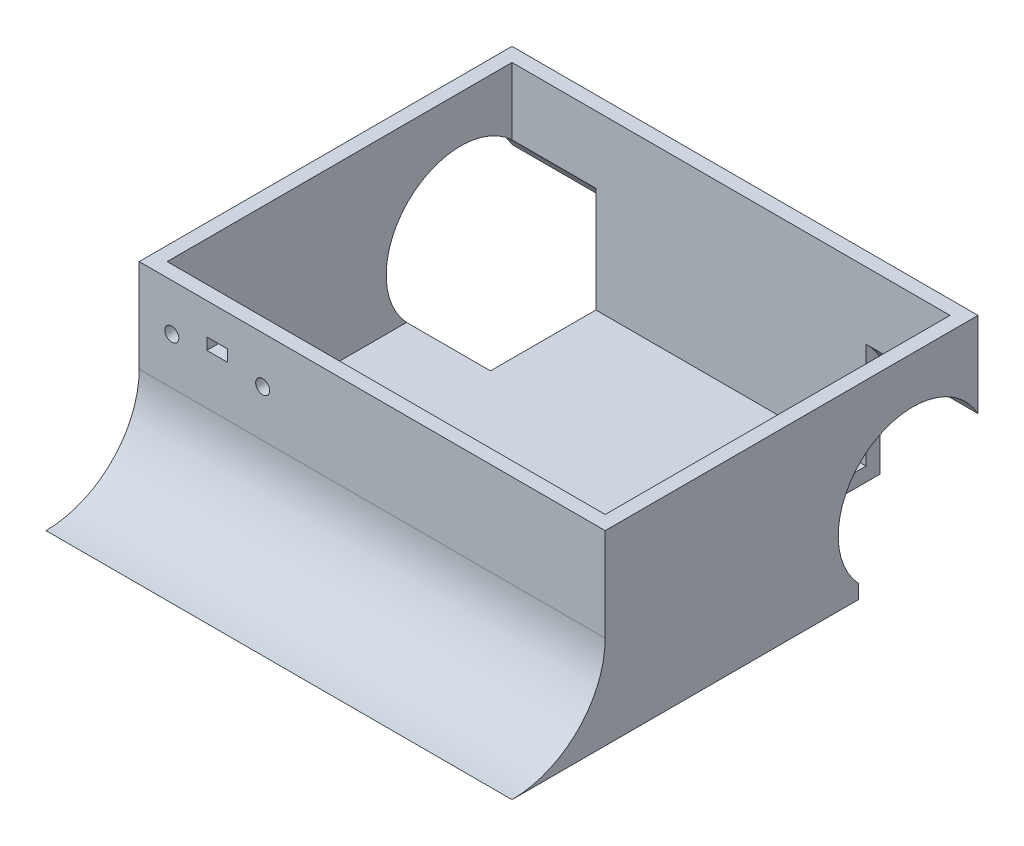
ISO-10303-21;
HEADER;
FILE_DESCRIPTION(('STEP AP214'),'2;1');
FILE_NAME('part.step','',(''),(''),'','','');
FILE_SCHEMA(('AUTOMOTIVE_DESIGN { 1 0 10303 214 1 1 1 1 }'));
ENDSEC;
DATA;
#1=APPLICATION_CONTEXT('core data for automotive mechanical design processes');
#2=APPLICATION_PROTOCOL_DEFINITION('international standard','automotive_design',2000,#1);
#3=PRODUCT_CONTEXT('',#1,'mechanical');
#4=PRODUCT('Part','Part','',(#3));
#5=PRODUCT_RELATED_PRODUCT_CATEGORY('part','',(#4));
#6=PRODUCT_DEFINITION_FORMATION('','',#4);
#7=PRODUCT_DEFINITION_CONTEXT('part definition',#1,'design');
#8=PRODUCT_DEFINITION('design','',#6,#7);
#9=PRODUCT_DEFINITION_SHAPE('','',#8);
#10=(LENGTH_UNIT() NAMED_UNIT(*) SI_UNIT(.MILLI.,.METRE.));
#11=(NAMED_UNIT(*) PLANE_ANGLE_UNIT() SI_UNIT($,.RADIAN.));
#12=(NAMED_UNIT(*) SI_UNIT($,.STERADIAN.) SOLID_ANGLE_UNIT());
#13=UNCERTAINTY_MEASURE_WITH_UNIT(LENGTH_MEASURE(1.E-05),#10,'distance_accuracy_value','');
#14=(GEOMETRIC_REPRESENTATION_CONTEXT(3) GLOBAL_UNCERTAINTY_ASSIGNED_CONTEXT((#13)) GLOBAL_UNIT_ASSIGNED_CONTEXT((#10,
#11,#12)) REPRESENTATION_CONTEXT('',''));
#15=CARTESIAN_POINT('',(0.,0.,0.));
#16=DIRECTION('',(0.,0.,1.));
#17=DIRECTION('',(1.,0.,0.));
#18=AXIS2_PLACEMENT_3D('',#15,#16,#17);
#19=CARTESIAN_POINT('',(-50.,0.,30.));
#20=DIRECTION('',(0.,0.,1.));
#21=DIRECTION('',(1.,0.,0.));
#22=AXIS2_PLACEMENT_3D('',#19,#20,#21);
#23=PLANE('',#22);
#24=CARTESIAN_POINT('',(-43.,10.,30.));
#25=DIRECTION('',(0.,0.,1.));
#26=DIRECTION('',(1.,0.,0.));
#27=AXIS2_PLACEMENT_3D('',#24,#25,#26);
#28=CIRCLE('',#27,1.5);
#29=CARTESIAN_POINT('',(-41.5,10.,30.));
#30=VERTEX_POINT('',#29);
#31=EDGE_CURVE('E209',#30,#30,#28,.F.);
#32=ORIENTED_EDGE('',*,*,#31,.T.);
#33=EDGE_LOOP('',(#32));
#34=FACE_BOUND('',#33,.T.);
#35=DIRECTION('',(1.,0.,0.));
#36=VECTOR('',#35,1.);
#37=CARTESIAN_POINT('',(-50.,20.,30.));
#38=LINE('',#37,#36);
#39=CARTESIAN_POINT('',(-50.,20.,30.));
#40=VERTEX_POINT('',#39);
#41=CARTESIAN_POINT('',(50.,20.,30.));
#42=VERTEX_POINT('',#41);
#43=EDGE_CURVE('E320',#40,#42,#38,.T.);
#44=ORIENTED_EDGE('',*,*,#43,.F.);
#45=DIRECTION('',(0.,-1.,0.));
#46=VECTOR('',#45,1.);
#47=CARTESIAN_POINT('',(-50.,0.,30.));
#48=LINE('',#47,#46);
#49=CARTESIAN_POINT('',(-50.,0.,30.));
#50=VERTEX_POINT('',#49);
#51=EDGE_CURVE('E317',#40,#50,#48,.T.);
#52=ORIENTED_EDGE('',*,*,#51,.T.);
#53=DIRECTION('',(1.,0.,0.));
#54=VECTOR('',#53,1.);
#55=CARTESIAN_POINT('',(-50.,0.,30.));
#56=LINE('',#55,#54);
#57=CARTESIAN_POINT('',(50.,0.,30.));
#58=VERTEX_POINT('',#57);
#59=EDGE_CURVE('E319',#50,#58,#56,.T.);
#60=ORIENTED_EDGE('',*,*,#59,.T.);
#61=DIRECTION('',(0.,-1.,0.));
#62=VECTOR('',#61,1.);
#63=CARTESIAN_POINT('',(50.,0.,30.));
#64=LINE('',#63,#62);
#65=EDGE_CURVE('E311',#42,#58,#64,.T.);
#66=ORIENTED_EDGE('',*,*,#65,.F.);
#67=EDGE_LOOP('',(#44,#52,#60,#66));
#68=FACE_BOUND('',#67,.T.);
#69=DIRECTION('',(1.,0.,0.));
#70=VECTOR('',#69,1.);
#71=CARTESIAN_POINT('',(-50.,13.25,30.));
#72=LINE('',#71,#70);
#73=CARTESIAN_POINT('',(-35.5,13.25,30.));
#74=VERTEX_POINT('',#73);
#75=CARTESIAN_POINT('',(-31.,13.25,30.));
#76=VERTEX_POINT('',#75);
#77=EDGE_CURVE('E205',#74,#76,#72,.T.);
#78=ORIENTED_EDGE('',*,*,#77,.T.);
#79=DIRECTION('',(0.,-1.,0.));
#80=VECTOR('',#79,1.);
#81=CARTESIAN_POINT('',(-31.,0.,30.));
#82=LINE('',#81,#80);
#83=CARTESIAN_POINT('',(-31.,10.75,30.));
#84=VERTEX_POINT('',#83);
#85=EDGE_CURVE('E199',#76,#84,#82,.T.);
#86=ORIENTED_EDGE('',*,*,#85,.T.);
#87=DIRECTION('',(-1.,0.,0.));
#88=VECTOR('',#87,1.);
#89=CARTESIAN_POINT('',(-50.,10.75,30.));
#90=LINE('',#89,#88);
#91=CARTESIAN_POINT('',(-35.5,10.75,30.));
#92=VERTEX_POINT('',#91);
#93=EDGE_CURVE('E188',#84,#92,#90,.T.);
#94=ORIENTED_EDGE('',*,*,#93,.T.);
#95=DIRECTION('',(0.,1.,0.));
#96=VECTOR('',#95,1.);
#97=CARTESIAN_POINT('',(-35.5,0.,30.));
#98=LINE('',#97,#96);
#99=EDGE_CURVE('E193',#92,#74,#98,.T.);
#100=ORIENTED_EDGE('',*,*,#99,.T.);
#101=EDGE_LOOP('',(#78,#86,#94,#100));
#102=FACE_BOUND('',#101,.T.);
#103=CARTESIAN_POINT('',(-23.5,10.,30.));
#104=DIRECTION('',(0.,0.,1.));
#105=DIRECTION('',(1.,0.,0.));
#106=AXIS2_PLACEMENT_3D('',#103,#104,#105);
#107=CIRCLE('',#106,1.5);
#108=CARTESIAN_POINT('',(-22.,10.,30.));
#109=VERTEX_POINT('',#108);
#110=EDGE_CURVE('E215',#109,#109,#107,.F.);
#111=ORIENTED_EDGE('',*,*,#110,.T.);
#112=EDGE_LOOP('',(#111));
#113=FACE_BOUND('',#112,.T.);
#114=ADVANCED_FACE('F40',(#34,#68,#102,#113),#23,.T.);
#115=CARTESIAN_POINT('',(-47.,20.,27.));
#116=DIRECTION('',(0.,0.,-1.));
#117=DIRECTION('',(-1.,0.,0.));
#118=AXIS2_PLACEMENT_3D('',#115,#116,#117);
#119=PLANE('',#118);
#120=CARTESIAN_POINT('',(-43.,10.,27.));
#121=DIRECTION('',(0.,0.,-1.));
#122=DIRECTION('',(-1.,0.,0.));
#123=AXIS2_PLACEMENT_3D('',#120,#121,#122);
#124=CIRCLE('',#123,1.5);
#125=CARTESIAN_POINT('',(-44.5,10.,27.));
#126=VERTEX_POINT('',#125);
#127=EDGE_CURVE('E206',#126,#126,#124,.F.);
#128=ORIENTED_EDGE('',*,*,#127,.T.);
#129=EDGE_LOOP('',(#128));
#130=FACE_BOUND('',#129,.T.);
#131=DIRECTION('',(0.,-1.,0.));
#132=VECTOR('',#131,1.);
#133=CARTESIAN_POINT('',(47.,20.,27.));
#134=LINE('',#133,#132);
#135=CARTESIAN_POINT('',(47.,20.,27.));
#136=VERTEX_POINT('',#135);
#137=CARTESIAN_POINT('',(47.,-17.,27.));
#138=VERTEX_POINT('',#137);
#139=EDGE_CURVE('E298',#136,#138,#134,.T.);
#140=ORIENTED_EDGE('',*,*,#139,.T.);
#141=DIRECTION('',(1.,0.,0.));
#142=VECTOR('',#141,1.);
#143=CARTESIAN_POINT('',(-47.,-17.,27.));
#144=LINE('',#143,#142);
#145=CARTESIAN_POINT('',(-47.,-17.,27.));
#146=VERTEX_POINT('',#145);
#147=EDGE_CURVE('E278',#146,#138,#144,.T.);
#148=ORIENTED_EDGE('',*,*,#147,.F.);
#149=DIRECTION('',(0.,-1.,0.));
#150=VECTOR('',#149,1.);
#151=CARTESIAN_POINT('',(-47.,20.,27.));
#152=LINE('',#151,#150);
#153=CARTESIAN_POINT('',(-47.,20.,27.));
#154=VERTEX_POINT('',#153);
#155=EDGE_CURVE('E300',#154,#146,#152,.T.);
#156=ORIENTED_EDGE('',*,*,#155,.F.);
#157=DIRECTION('',(1.,0.,0.));
#158=VECTOR('',#157,1.);
#159=CARTESIAN_POINT('',(-47.,20.,27.));
#160=LINE('',#159,#158);
#161=EDGE_CURVE('E296',#154,#136,#160,.T.);
#162=ORIENTED_EDGE('',*,*,#161,.T.);
#163=EDGE_LOOP('',(#140,#148,#156,#162));
#164=FACE_BOUND('',#163,.T.);
#165=DIRECTION('',(1.,0.,0.));
#166=VECTOR('',#165,1.);
#167=CARTESIAN_POINT('',(-47.,10.75,27.));
#168=LINE('',#167,#166);
#169=CARTESIAN_POINT('',(-35.5,10.75,27.));
#170=VERTEX_POINT('',#169);
#171=CARTESIAN_POINT('',(-31.,10.75,27.));
#172=VERTEX_POINT('',#171);
#173=EDGE_CURVE('E359',#170,#172,#168,.T.);
#174=ORIENTED_EDGE('',*,*,#173,.T.);
#175=DIRECTION('',(0.,1.,0.));
#176=VECTOR('',#175,1.);
#177=CARTESIAN_POINT('',(-31.,20.,27.));
#178=LINE('',#177,#176);
#179=CARTESIAN_POINT('',(-31.,13.25,27.));
#180=VERTEX_POINT('',#179);
#181=EDGE_CURVE('E12',#172,#180,#178,.T.);
#182=ORIENTED_EDGE('',*,*,#181,.T.);
#183=DIRECTION('',(-1.,0.,0.));
#184=VECTOR('',#183,1.);
#185=CARTESIAN_POINT('',(-47.,13.25,27.));
#186=LINE('',#185,#184);
#187=CARTESIAN_POINT('',(-35.5,13.25,27.));
#188=VERTEX_POINT('',#187);
#189=EDGE_CURVE('E49',#180,#188,#186,.T.);
#190=ORIENTED_EDGE('',*,*,#189,.T.);
#191=DIRECTION('',(0.,-1.,0.));
#192=VECTOR('',#191,1.);
#193=CARTESIAN_POINT('',(-35.5,20.,27.));
#194=LINE('',#193,#192);
#195=EDGE_CURVE('E361',#188,#170,#194,.T.);
#196=ORIENTED_EDGE('',*,*,#195,.T.);
#197=EDGE_LOOP('',(#174,#182,#190,#196));
#198=FACE_BOUND('',#197,.T.);
#199=CARTESIAN_POINT('',(-23.5,10.,27.));
#200=DIRECTION('',(0.,0.,-1.));
#201=DIRECTION('',(-1.,0.,0.));
#202=AXIS2_PLACEMENT_3D('',#199,#200,#201);
#203=CIRCLE('',#202,1.5);
#204=CARTESIAN_POINT('',(-25.,10.,27.));
#205=VERTEX_POINT('',#204);
#206=EDGE_CURVE('E44',#205,#205,#203,.F.);
#207=ORIENTED_EDGE('',*,*,#206,.T.);
#208=EDGE_LOOP('',(#207));
#209=FACE_BOUND('',#208,.T.);
#210=ADVANCED_FACE('F366',(#130,#164,#198,#209),#119,.T.);
#211=CARTESIAN_POINT('',(-50.,20.,-50.));
#212=DIRECTION('',(0.,0.,1.));
#213=DIRECTION('',(1.,0.,0.));
#214=AXIS2_PLACEMENT_3D('',#211,#212,#213);
#215=PLANE('',#214);
#216=DIRECTION('',(-1.,0.,0.));
#217=VECTOR('',#216,1.);
#218=CARTESIAN_POINT('',(-29.,1.74596669241484,-50.));
#219=LINE('',#218,#217);
#220=CARTESIAN_POINT('',(-50.,1.74596669241484,-50.));
#221=VERTEX_POINT('',#220);
#222=CARTESIAN_POINT('',(-29.,1.74596669241484,-50.));
#223=VERTEX_POINT('',#222);
#224=EDGE_CURVE('E247',#221,#223,#219,.F.);
#225=ORIENTED_EDGE('',*,*,#224,.F.);
#226=DIRECTION('',(0.,-1.,0.));
#227=VECTOR('',#226,1.);
#228=CARTESIAN_POINT('',(-50.,20.,-50.));
#229=LINE('',#228,#227);
#230=CARTESIAN_POINT('',(-50.,20.,-50.));
#231=VERTEX_POINT('',#230);
#232=EDGE_CURVE('E334',#231,#221,#229,.T.);
#233=ORIENTED_EDGE('',*,*,#232,.F.);
#234=DIRECTION('',(-1.,0.,0.));
#235=VECTOR('',#234,1.);
#236=CARTESIAN_POINT('',(-50.,20.,-50.));
#237=LINE('',#236,#235);
#238=CARTESIAN_POINT('',(50.,20.,-50.));
#239=VERTEX_POINT('',#238);
#240=EDGE_CURVE('E328',#239,#231,#237,.T.);
#241=ORIENTED_EDGE('',*,*,#240,.F.);
#242=DIRECTION('',(0.,-1.,0.));
#243=VECTOR('',#242,1.);
#244=CARTESIAN_POINT('',(50.,20.,-50.));
#245=LINE('',#244,#243);
#246=CARTESIAN_POINT('',(50.,1.74596669241484,-50.));
#247=VERTEX_POINT('',#246);
#248=EDGE_CURVE('E345',#239,#247,#245,.T.);
#249=ORIENTED_EDGE('',*,*,#248,.T.);
#250=DIRECTION('',(1.,0.,0.));
#251=VECTOR('',#250,1.);
#252=CARTESIAN_POINT('',(29.,1.74596669241484,-50.));
#253=LINE('',#252,#251);
#254=CARTESIAN_POINT('',(29.,1.74596669241484,-50.));
#255=VERTEX_POINT('',#254);
#256=EDGE_CURVE('E275',#255,#247,#253,.T.);
#257=ORIENTED_EDGE('',*,*,#256,.F.);
#258=DIRECTION('',(0.,-1.,0.));
#259=VECTOR('',#258,1.);
#260=CARTESIAN_POINT('',(29.,20.,-50.));
#261=LINE('',#260,#259);
#262=CARTESIAN_POINT('',(29.,-20.,-50.));
#263=VERTEX_POINT('',#262);
#264=EDGE_CURVE('E266',#255,#263,#261,.T.);
#265=ORIENTED_EDGE('',*,*,#264,.T.);
#266=DIRECTION('',(-1.,0.,0.));
#267=VECTOR('',#266,1.);
#268=CARTESIAN_POINT('',(-50.,-20.,-50.));
#269=LINE('',#268,#267);
#270=CARTESIAN_POINT('',(-29.,-20.,-50.));
#271=VERTEX_POINT('',#270);
#272=EDGE_CURVE('E337',#263,#271,#269,.T.);
#273=ORIENTED_EDGE('',*,*,#272,.T.);
#274=DIRECTION('',(0.,1.,0.));
#275=VECTOR('',#274,1.);
#276=CARTESIAN_POINT('',(-29.,20.,-50.));
#277=LINE('',#276,#275);
#278=EDGE_CURVE('E253',#271,#223,#277,.T.);
#279=ORIENTED_EDGE('',*,*,#278,.T.);
#280=EDGE_LOOP('',(#225,#233,#241,#249,#257,#265,#273,#279));
#281=FACE_BOUND('',#280,.T.);
#282=ADVANCED_FACE('F393',(#281),#215,.F.);
#283=CARTESIAN_POINT('',(0.,-20.,0.));
#284=DIRECTION('',(0.,-1.,0.));
#285=DIRECTION('',(0.,0.,-1.));
#286=AXIS2_PLACEMENT_3D('',#283,#284,#285);
#287=PLANE('',#286);
#288=DIRECTION('',(-1.,0.,0.));
#289=VECTOR('',#288,1.);
#290=CARTESIAN_POINT('',(0.,-20.,-24.3810499613778));
#291=LINE('',#290,#289);
#292=CARTESIAN_POINT('',(-29.,-20.,-24.3810499613778));
#293=VERTEX_POINT('',#292);
#294=CARTESIAN_POINT('',(-50.,-20.,-24.3810499613778));
#295=VERTEX_POINT('',#294);
#296=EDGE_CURVE('E222',#293,#295,#291,.T.);
#297=ORIENTED_EDGE('',*,*,#296,.F.);
#298=DIRECTION('',(0.,0.,1.));
#299=VECTOR('',#298,1.);
#300=CARTESIAN_POINT('',(-29.,-20.,0.));
#301=LINE('',#300,#299);
#302=EDGE_CURVE('E251',#271,#293,#301,.T.);
#303=ORIENTED_EDGE('',*,*,#302,.F.);
#304=ORIENTED_EDGE('',*,*,#272,.F.);
#305=DIRECTION('',(0.,0.,-1.));
#306=VECTOR('',#305,1.);
#307=CARTESIAN_POINT('',(29.,-20.,0.));
#308=LINE('',#307,#306);
#309=CARTESIAN_POINT('',(29.,-20.,-24.3810499613778));
#310=VERTEX_POINT('',#309);
#311=EDGE_CURVE('E264',#310,#263,#308,.T.);
#312=ORIENTED_EDGE('',*,*,#311,.F.);
#313=DIRECTION('',(-1.,0.,0.));
#314=VECTOR('',#313,1.);
#315=CARTESIAN_POINT('',(0.,-20.,-24.3810499613778));
#316=LINE('',#315,#314);
#317=CARTESIAN_POINT('',(50.,-20.,-24.3810499613778));
#318=VERTEX_POINT('',#317);
#319=EDGE_CURVE('E232',#318,#310,#316,.T.);
#320=ORIENTED_EDGE('',*,*,#319,.F.);
#321=DIRECTION('',(0.,0.,-1.));
#322=VECTOR('',#321,1.);
#323=CARTESIAN_POINT('',(50.,-20.,50.));
#324=LINE('',#323,#322);
#325=CARTESIAN_POINT('',(50.,-20.,50.));
#326=VERTEX_POINT('',#325);
#327=EDGE_CURVE('E323',#326,#318,#324,.T.);
#328=ORIENTED_EDGE('',*,*,#327,.F.);
#329=DIRECTION('',(1.,0.,0.));
#330=VECTOR('',#329,1.);
#331=CARTESIAN_POINT('',(-50.,-20.,50.));
#332=LINE('',#331,#330);
#333=CARTESIAN_POINT('',(-50.,-20.,50.));
#334=VERTEX_POINT('',#333);
#335=EDGE_CURVE('E329',#334,#326,#332,.T.);
#336=ORIENTED_EDGE('',*,*,#335,.F.);
#337=DIRECTION('',(0.,0.,1.));
#338=VECTOR('',#337,1.);
#339=CARTESIAN_POINT('',(-50.,-20.,50.));
#340=LINE('',#339,#338);
#341=EDGE_CURVE('E340',#295,#334,#340,.T.);
#342=ORIENTED_EDGE('',*,*,#341,.F.);
#343=EDGE_LOOP('',(#297,#303,#304,#312,#320,#328,#336,#342));
#344=FACE_BOUND('',#343,.T.);
#345=ADVANCED_FACE('F411',(#344),#287,.T.);
#346=CARTESIAN_POINT('',(-47.,20.,-47.));
#347=DIRECTION('',(0.,0.,1.));
#348=DIRECTION('',(1.,0.,0.));
#349=AXIS2_PLACEMENT_3D('',#346,#347,#348);
#350=PLANE('',#349);
#351=DIRECTION('',(0.,-1.,0.));
#352=VECTOR('',#351,1.);
#353=CARTESIAN_POINT('',(-47.,20.,-47.));
#354=LINE('',#353,#352);
#355=CARTESIAN_POINT('',(-47.,20.,-47.));
#356=VERTEX_POINT('',#355);
#357=CARTESIAN_POINT('',(-47.,5.61895003862226,-47.));
#358=VERTEX_POINT('',#357);
#359=EDGE_CURVE('E303',#356,#358,#354,.T.);
#360=ORIENTED_EDGE('',*,*,#359,.T.);
#361=DIRECTION('',(-1.,0.,0.));
#362=VECTOR('',#361,1.);
#363=CARTESIAN_POINT('',(-29.,5.61895003862226,-47.));
#364=LINE('',#363,#362);
#365=CARTESIAN_POINT('',(-29.,5.61895003862226,-47.));
#366=VERTEX_POINT('',#365);
#367=EDGE_CURVE('E244',#358,#366,#364,.F.);
#368=ORIENTED_EDGE('',*,*,#367,.T.);
#369=DIRECTION('',(0.,1.,0.));
#370=VECTOR('',#369,1.);
#371=CARTESIAN_POINT('',(-29.,20.,-47.));
#372=LINE('',#371,#370);
#373=CARTESIAN_POINT('',(-29.,-17.,-47.));
#374=VERTEX_POINT('',#373);
#375=EDGE_CURVE('E249',#374,#366,#372,.T.);
#376=ORIENTED_EDGE('',*,*,#375,.F.);
#377=DIRECTION('',(-1.,0.,0.));
#378=VECTOR('',#377,1.);
#379=CARTESIAN_POINT('',(-47.,-17.,-47.));
#380=LINE('',#379,#378);
#381=CARTESIAN_POINT('',(29.,-17.,-47.));
#382=VERTEX_POINT('',#381);
#383=EDGE_CURVE('E285',#382,#374,#380,.T.);
#384=ORIENTED_EDGE('',*,*,#383,.F.);
#385=DIRECTION('',(0.,-1.,0.));
#386=VECTOR('',#385,1.);
#387=CARTESIAN_POINT('',(29.,20.,-47.));
#388=LINE('',#387,#386);
#389=CARTESIAN_POINT('',(29.,5.61895003862226,-47.));
#390=VERTEX_POINT('',#389);
#391=EDGE_CURVE('E260',#390,#382,#388,.T.);
#392=ORIENTED_EDGE('',*,*,#391,.F.);
#393=DIRECTION('',(1.,0.,0.));
#394=VECTOR('',#393,1.);
#395=CARTESIAN_POINT('',(29.,5.61895003862226,-47.));
#396=LINE('',#395,#394);
#397=CARTESIAN_POINT('',(47.,5.61895003862226,-47.));
#398=VERTEX_POINT('',#397);
#399=EDGE_CURVE('E272',#390,#398,#396,.T.);
#400=ORIENTED_EDGE('',*,*,#399,.T.);
#401=DIRECTION('',(0.,-1.,0.));
#402=VECTOR('',#401,1.);
#403=CARTESIAN_POINT('',(47.,20.,-47.));
#404=LINE('',#403,#402);
#405=CARTESIAN_POINT('',(47.,20.,-47.));
#406=VERTEX_POINT('',#405);
#407=EDGE_CURVE('E306',#406,#398,#404,.T.);
#408=ORIENTED_EDGE('',*,*,#407,.F.);
#409=DIRECTION('',(-1.,0.,0.));
#410=VECTOR('',#409,1.);
#411=CARTESIAN_POINT('',(-47.,20.,-47.));
#412=LINE('',#411,#410);
#413=EDGE_CURVE('E291',#406,#356,#412,.T.);
#414=ORIENTED_EDGE('',*,*,#413,.T.);
#415=EDGE_LOOP('',(#360,#368,#376,#384,#392,#400,#408,#414));
#416=FACE_BOUND('',#415,.T.);
#417=ADVANCED_FACE('F414',(#416),#350,.T.);
#418=CARTESIAN_POINT('',(0.,-17.,0.));
#419=DIRECTION('',(0.,-1.,0.));
#420=DIRECTION('',(0.,0.,-1.));
#421=AXIS2_PLACEMENT_3D('',#418,#419,#420);
#422=PLANE('',#421);
#423=DIRECTION('',(-1.,0.,0.));
#424=VECTOR('',#423,1.);
#425=CARTESIAN_POINT('',(-29.,-17.,-24.3810499613778));
#426=LINE('',#425,#424);
#427=CARTESIAN_POINT('',(-47.,-17.,-24.3810499613778));
#428=VERTEX_POINT('',#427);
#429=CARTESIAN_POINT('',(-29.,-17.,-24.3810499613778));
#430=VERTEX_POINT('',#429);
#431=EDGE_CURVE('E239',#428,#430,#426,.F.);
#432=ORIENTED_EDGE('',*,*,#431,.F.);
#433=DIRECTION('',(0.,0.,1.));
#434=VECTOR('',#433,1.);
#435=CARTESIAN_POINT('',(-47.,-17.,-47.));
#436=LINE('',#435,#434);
#437=EDGE_CURVE('E282',#428,#146,#436,.T.);
#438=ORIENTED_EDGE('',*,*,#437,.T.);
#439=ORIENTED_EDGE('',*,*,#147,.T.);
#440=DIRECTION('',(0.,0.,-1.));
#441=VECTOR('',#440,1.);
#442=CARTESIAN_POINT('',(47.,-17.,-47.));
#443=LINE('',#442,#441);
#444=CARTESIAN_POINT('',(47.,-17.,-24.3810499613778));
#445=VERTEX_POINT('',#444);
#446=EDGE_CURVE('E281',#138,#445,#443,.T.);
#447=ORIENTED_EDGE('',*,*,#446,.T.);
#448=DIRECTION('',(1.,0.,0.));
#449=VECTOR('',#448,1.);
#450=CARTESIAN_POINT('',(29.,-17.,-24.3810499613778));
#451=LINE('',#450,#449);
#452=CARTESIAN_POINT('',(29.,-17.,-24.3810499613778));
#453=VERTEX_POINT('',#452);
#454=EDGE_CURVE('E350',#453,#445,#451,.T.);
#455=ORIENTED_EDGE('',*,*,#454,.F.);
#456=DIRECTION('',(0.,0.,-1.));
#457=VECTOR('',#456,1.);
#458=CARTESIAN_POINT('',(29.,-17.,0.));
#459=LINE('',#458,#457);
#460=EDGE_CURVE('E348',#453,#382,#459,.T.);
#461=ORIENTED_EDGE('',*,*,#460,.T.);
#462=ORIENTED_EDGE('',*,*,#383,.T.);
#463=DIRECTION('',(0.,0.,1.));
#464=VECTOR('',#463,1.);
#465=CARTESIAN_POINT('',(-29.,-17.,0.));
#466=LINE('',#465,#464);
#467=EDGE_CURVE('E355',#374,#430,#466,.T.);
#468=ORIENTED_EDGE('',*,*,#467,.T.);
#469=EDGE_LOOP('',(#432,#438,#439,#447,#455,#461,#462,#468));
#470=FACE_BOUND('',#469,.T.);
#471=ADVANCED_FACE('F409',(#470),#422,.F.);
#472=CARTESIAN_POINT('',(0.,20.,0.));
#473=DIRECTION('',(0.,-1.,0.));
#474=DIRECTION('',(0.,0.,-1.));
#475=AXIS2_PLACEMENT_3D('',#472,#473,#474);
#476=PLANE('',#475);
#477=ORIENTED_EDGE('',*,*,#43,.T.);
#478=DIRECTION('',(0.,0.,-1.));
#479=VECTOR('',#478,1.);
#480=CARTESIAN_POINT('',(50.,20.,50.));
#481=LINE('',#480,#479);
#482=EDGE_CURVE('E326',#42,#239,#481,.T.);
#483=ORIENTED_EDGE('',*,*,#482,.T.);
#484=ORIENTED_EDGE('',*,*,#240,.T.);
#485=DIRECTION('',(0.,0.,1.));
#486=VECTOR('',#485,1.);
#487=CARTESIAN_POINT('',(-50.,20.,50.));
#488=LINE('',#487,#486);
#489=EDGE_CURVE('E331',#231,#40,#488,.T.);
#490=ORIENTED_EDGE('',*,*,#489,.T.);
#491=EDGE_LOOP('',(#477,#483,#484,#490));
#492=FACE_BOUND('',#491,.T.);
#493=DIRECTION('',(0.,0.,-1.));
#494=VECTOR('',#493,1.);
#495=CARTESIAN_POINT('',(47.,20.,-47.));
#496=LINE('',#495,#494);
#497=EDGE_CURVE('E284',#136,#406,#496,.T.);
#498=ORIENTED_EDGE('',*,*,#497,.F.);
#499=ORIENTED_EDGE('',*,*,#161,.F.);
#500=DIRECTION('',(0.,0.,1.));
#501=VECTOR('',#500,1.);
#502=CARTESIAN_POINT('',(-47.,20.,-47.));
#503=LINE('',#502,#501);
#504=EDGE_CURVE('E293',#356,#154,#503,.T.);
#505=ORIENTED_EDGE('',*,*,#504,.F.);
#506=ORIENTED_EDGE('',*,*,#413,.F.);
#507=EDGE_LOOP('',(#498,#499,#505,#506));
#508=FACE_BOUND('',#507,.T.);
#509=ADVANCED_FACE('F406',(#492,#508),#476,.F.);
#510=CARTESIAN_POINT('',(50.,20.,50.));
#511=DIRECTION('',(-1.,0.,0.));
#512=DIRECTION('',(0.,0.,1.));
#513=AXIS2_PLACEMENT_3D('',#510,#511,#512);
#514=PLANE('',#513);
#515=ORIENTED_EDGE('',*,*,#327,.T.);
#516=DIRECTION('',(0.,1.,0.));
#517=VECTOR('',#516,1.);
#518=CARTESIAN_POINT('',(50.,-21.,-24.3810499613778));
#519=LINE('',#518,#517);
#520=CARTESIAN_POINT('',(50.,-17.,-24.3810499613778));
#521=VERTEX_POINT('',#520);
#522=EDGE_CURVE('E225',#318,#521,#519,.T.);
#523=ORIENTED_EDGE('',*,*,#522,.T.);
#524=CARTESIAN_POINT('',(50.,-6.,-36.));
#525=DIRECTION('',(-1.,0.,0.));
#526=DIRECTION('',(0.,0.,1.));
#527=AXIS2_PLACEMENT_3D('',#524,#525,#526);
#528=CIRCLE('',#527,16.);
#529=EDGE_CURVE('E256',#521,#247,#528,.T.);
#530=ORIENTED_EDGE('',*,*,#529,.T.);
#531=ORIENTED_EDGE('',*,*,#248,.F.);
#532=ORIENTED_EDGE('',*,*,#482,.F.);
#533=ORIENTED_EDGE('',*,*,#65,.T.);
#534=CARTESIAN_POINT('',(50.,0.,50.));
#535=DIRECTION('',(1.,0.,0.));
#536=DIRECTION('',(0.,0.,-1.));
#537=AXIS2_PLACEMENT_3D('',#534,#535,#536);
#538=CIRCLE('',#537,20.);
#539=EDGE_CURVE('E309',#326,#58,#538,.T.);
#540=ORIENTED_EDGE('',*,*,#539,.F.);
#541=EDGE_LOOP('',(#515,#523,#530,#531,#532,#533,#540));
#542=FACE_BOUND('',#541,.T.);
#543=ADVANCED_FACE('F42',(#542),#514,.F.);
#544=CARTESIAN_POINT('',(-50.,20.,50.));
#545=DIRECTION('',(1.,0.,0.));
#546=DIRECTION('',(0.,0.,-1.));
#547=AXIS2_PLACEMENT_3D('',#544,#545,#546);
#548=PLANE('',#547);
#549=CARTESIAN_POINT('',(-50.,-6.,-36.));
#550=DIRECTION('',(1.,0.,0.));
#551=DIRECTION('',(0.,0.,-1.));
#552=AXIS2_PLACEMENT_3D('',#549,#550,#551);
#553=CIRCLE('',#552,16.);
#554=CARTESIAN_POINT('',(-50.,-17.,-24.3810499613778));
#555=VERTEX_POINT('',#554);
#556=EDGE_CURVE('E235',#221,#555,#553,.T.);
#557=ORIENTED_EDGE('',*,*,#556,.T.);
#558=DIRECTION('',(0.,1.,0.));
#559=VECTOR('',#558,1.);
#560=CARTESIAN_POINT('',(-50.,-21.,-24.3810499613778));
#561=LINE('',#560,#559);
#562=EDGE_CURVE('E223',#295,#555,#561,.T.);
#563=ORIENTED_EDGE('',*,*,#562,.F.);
#564=ORIENTED_EDGE('',*,*,#341,.T.);
#565=CARTESIAN_POINT('',(-50.,0.,50.));
#566=DIRECTION('',(1.,0.,0.));
#567=DIRECTION('',(0.,0.,-1.));
#568=AXIS2_PLACEMENT_3D('',#565,#566,#567);
#569=CIRCLE('',#568,20.);
#570=EDGE_CURVE('E314',#334,#50,#569,.T.);
#571=ORIENTED_EDGE('',*,*,#570,.T.);
#572=ORIENTED_EDGE('',*,*,#51,.F.);
#573=ORIENTED_EDGE('',*,*,#489,.F.);
#574=ORIENTED_EDGE('',*,*,#232,.T.);
#575=EDGE_LOOP('',(#557,#563,#564,#571,#572,#573,#574));
#576=FACE_BOUND('',#575,.T.);
#577=ADVANCED_FACE('F404',(#576),#548,.F.);
#578=CARTESIAN_POINT('',(-50.,0.,50.));
#579=DIRECTION('',(1.,0.,0.));
#580=DIRECTION('',(0.,0.,-1.));
#581=AXIS2_PLACEMENT_3D('',#578,#579,#580);
#582=CYLINDRICAL_SURFACE('',#581,20.);
#583=ORIENTED_EDGE('',*,*,#335,.T.);
#584=ORIENTED_EDGE('',*,*,#539,.T.);
#585=ORIENTED_EDGE('',*,*,#59,.F.);
#586=ORIENTED_EDGE('',*,*,#570,.F.);
#587=EDGE_LOOP('',(#583,#584,#585,#586));
#588=FACE_BOUND('',#587,.T.);
#589=ADVANCED_FACE('F401',(#588),#582,.F.);
#590=CARTESIAN_POINT('',(47.,20.,-47.));
#591=DIRECTION('',(-1.,0.,0.));
#592=DIRECTION('',(0.,0.,1.));
#593=AXIS2_PLACEMENT_3D('',#590,#591,#592);
#594=PLANE('',#593);
#595=ORIENTED_EDGE('',*,*,#407,.T.);
#596=CARTESIAN_POINT('',(47.,-6.,-36.));
#597=DIRECTION('',(-1.,0.,0.));
#598=DIRECTION('',(0.,0.,1.));
#599=AXIS2_PLACEMENT_3D('',#596,#597,#598);
#600=CIRCLE('',#599,16.);
#601=EDGE_CURVE('E269',#398,#445,#600,.F.);
#602=ORIENTED_EDGE('',*,*,#601,.T.);
#603=ORIENTED_EDGE('',*,*,#446,.F.);
#604=ORIENTED_EDGE('',*,*,#139,.F.);
#605=ORIENTED_EDGE('',*,*,#497,.T.);
#606=EDGE_LOOP('',(#595,#602,#603,#604,#605));
#607=FACE_BOUND('',#606,.T.);
#608=ADVANCED_FACE('F399',(#607),#594,.T.);
#609=CARTESIAN_POINT('',(-47.,20.,-47.));
#610=DIRECTION('',(1.,0.,0.));
#611=DIRECTION('',(0.,0.,-1.));
#612=AXIS2_PLACEMENT_3D('',#609,#610,#611);
#613=PLANE('',#612);
#614=ORIENTED_EDGE('',*,*,#437,.F.);
#615=CARTESIAN_POINT('',(-47.,-6.,-36.));
#616=DIRECTION('',(1.,0.,0.));
#617=DIRECTION('',(0.,0.,-1.));
#618=AXIS2_PLACEMENT_3D('',#615,#616,#617);
#619=CIRCLE('',#618,16.);
#620=EDGE_CURVE('E352',#428,#358,#619,.F.);
#621=ORIENTED_EDGE('',*,*,#620,.T.);
#622=ORIENTED_EDGE('',*,*,#359,.F.);
#623=ORIENTED_EDGE('',*,*,#504,.T.);
#624=ORIENTED_EDGE('',*,*,#155,.T.);
#625=EDGE_LOOP('',(#614,#621,#622,#623,#624));
#626=FACE_BOUND('',#625,.T.);
#627=ADVANCED_FACE('F457',(#626),#613,.T.);
#628=CARTESIAN_POINT('',(29.,-6.,-36.));
#629=DIRECTION('',(1.,0.,0.));
#630=DIRECTION('',(0.,0.,-1.));
#631=AXIS2_PLACEMENT_3D('',#628,#629,#630);
#632=CYLINDRICAL_SURFACE('',#631,16.);
#633=DIRECTION('',(1.,0.,0.));
#634=VECTOR('',#633,1.);
#635=CARTESIAN_POINT('',(29.,-17.,-24.3810499613778));
#636=LINE('',#635,#634);
#637=EDGE_CURVE('E230',#445,#521,#636,.T.);
#638=ORIENTED_EDGE('',*,*,#637,.F.);
#639=ORIENTED_EDGE('',*,*,#601,.F.);
#640=ORIENTED_EDGE('',*,*,#399,.F.);
#641=CARTESIAN_POINT('',(29.,-6.,-36.));
#642=DIRECTION('',(-1.,0.,0.));
#643=DIRECTION('',(0.,0.,1.));
#644=AXIS2_PLACEMENT_3D('',#641,#642,#643);
#645=CIRCLE('',#644,16.);
#646=EDGE_CURVE('E257',#390,#255,#645,.T.);
#647=ORIENTED_EDGE('',*,*,#646,.T.);
#648=ORIENTED_EDGE('',*,*,#256,.T.);
#649=ORIENTED_EDGE('',*,*,#529,.F.);
#650=EDGE_LOOP('',(#638,#639,#640,#647,#648,#649));
#651=FACE_BOUND('',#650,.T.);
#652=ADVANCED_FACE('F438',(#651),#632,.F.);
#653=CARTESIAN_POINT('',(29.,-6.,-36.));
#654=DIRECTION('',(-1.,0.,0.));
#655=DIRECTION('',(0.,0.,1.));
#656=AXIS2_PLACEMENT_3D('',#653,#654,#655);
#657=PLANE('',#656);
#658=ORIENTED_EDGE('',*,*,#391,.T.);
#659=ORIENTED_EDGE('',*,*,#460,.F.);
#660=DIRECTION('',(0.,1.,0.));
#661=VECTOR('',#660,1.);
#662=CARTESIAN_POINT('',(29.,-21.,-24.3810499613778));
#663=LINE('',#662,#661);
#664=EDGE_CURVE('E218',#310,#453,#663,.T.);
#665=ORIENTED_EDGE('',*,*,#664,.F.);
#666=ORIENTED_EDGE('',*,*,#311,.T.);
#667=ORIENTED_EDGE('',*,*,#264,.F.);
#668=ORIENTED_EDGE('',*,*,#646,.F.);
#669=EDGE_LOOP('',(#658,#659,#665,#666,#667,#668));
#670=FACE_BOUND('',#669,.T.);
#671=ADVANCED_FACE('F475',(#670),#657,.F.);
#672=CARTESIAN_POINT('',(-29.,-6.,-36.));
#673=DIRECTION('',(1.,0.,0.));
#674=DIRECTION('',(0.,0.,-1.));
#675=AXIS2_PLACEMENT_3D('',#672,#673,#674);
#676=PLANE('',#675);
#677=ORIENTED_EDGE('',*,*,#302,.T.);
#678=DIRECTION('',(0.,1.,0.));
#679=VECTOR('',#678,1.);
#680=CARTESIAN_POINT('',(-29.,-21.,-24.3810499613778));
#681=LINE('',#680,#679);
#682=EDGE_CURVE('E219',#293,#430,#681,.T.);
#683=ORIENTED_EDGE('',*,*,#682,.T.);
#684=ORIENTED_EDGE('',*,*,#467,.F.);
#685=ORIENTED_EDGE('',*,*,#375,.T.);
#686=CARTESIAN_POINT('',(-29.,-6.,-36.));
#687=DIRECTION('',(1.,0.,0.));
#688=DIRECTION('',(0.,0.,-1.));
#689=AXIS2_PLACEMENT_3D('',#686,#687,#688);
#690=CIRCLE('',#689,16.);
#691=EDGE_CURVE('E236',#223,#366,#690,.T.);
#692=ORIENTED_EDGE('',*,*,#691,.F.);
#693=ORIENTED_EDGE('',*,*,#278,.F.);
#694=EDGE_LOOP('',(#677,#683,#684,#685,#692,#693));
#695=FACE_BOUND('',#694,.T.);
#696=ADVANCED_FACE('F448',(#695),#676,.F.);
#697=CARTESIAN_POINT('',(-29.,-6.,-36.));
#698=DIRECTION('',(-1.,0.,0.));
#699=DIRECTION('',(0.,0.,1.));
#700=AXIS2_PLACEMENT_3D('',#697,#698,#699);
#701=CYLINDRICAL_SURFACE('',#700,16.);
#702=DIRECTION('',(-1.,0.,0.));
#703=VECTOR('',#702,1.);
#704=CARTESIAN_POINT('',(-29.,-17.,-24.3810499613778));
#705=LINE('',#704,#703);
#706=EDGE_CURVE('E357',#555,#428,#705,.F.);
#707=ORIENTED_EDGE('',*,*,#706,.F.);
#708=ORIENTED_EDGE('',*,*,#556,.F.);
#709=ORIENTED_EDGE('',*,*,#224,.T.);
#710=ORIENTED_EDGE('',*,*,#691,.T.);
#711=ORIENTED_EDGE('',*,*,#367,.F.);
#712=ORIENTED_EDGE('',*,*,#620,.F.);
#713=EDGE_LOOP('',(#707,#708,#709,#710,#711,#712));
#714=FACE_BOUND('',#713,.T.);
#715=ADVANCED_FACE('F484',(#714),#701,.F.);
#716=CARTESIAN_POINT('',(-29.,-21.,-24.3810499613778));
#717=DIRECTION('',(0.,0.,1.));
#718=DIRECTION('',(1.,0.,0.));
#719=AXIS2_PLACEMENT_3D('',#716,#717,#718);
#720=PLANE('',#719);
#721=ORIENTED_EDGE('',*,*,#296,.T.);
#722=ORIENTED_EDGE('',*,*,#562,.T.);
#723=ORIENTED_EDGE('',*,*,#706,.T.);
#724=ORIENTED_EDGE('',*,*,#431,.T.);
#725=ORIENTED_EDGE('',*,*,#682,.F.);
#726=EDGE_LOOP('',(#721,#722,#723,#724,#725));
#727=FACE_BOUND('',#726,.T.);
#728=ADVANCED_FACE('F450',(#727),#720,.F.);
#729=CARTESIAN_POINT('',(29.,-21.,-24.3810499613778));
#730=DIRECTION('',(0.,0.,1.));
#731=DIRECTION('',(1.,0.,0.));
#732=AXIS2_PLACEMENT_3D('',#729,#730,#731);
#733=PLANE('',#732);
#734=ORIENTED_EDGE('',*,*,#319,.T.);
#735=ORIENTED_EDGE('',*,*,#664,.T.);
#736=ORIENTED_EDGE('',*,*,#454,.T.);
#737=ORIENTED_EDGE('',*,*,#637,.T.);
#738=ORIENTED_EDGE('',*,*,#522,.F.);
#739=EDGE_LOOP('',(#734,#735,#736,#737,#738));
#740=FACE_BOUND('',#739,.T.);
#741=ADVANCED_FACE('F478',(#740),#733,.F.);
#742=CARTESIAN_POINT('',(-31.,13.25,50.));
#743=DIRECTION('',(-1.,0.,0.));
#744=DIRECTION('',(0.,0.,1.));
#745=AXIS2_PLACEMENT_3D('',#742,#743,#744);
#746=PLANE('',#745);
#747=DIRECTION('',(0.,0.,-1.));
#748=VECTOR('',#747,1.);
#749=CARTESIAN_POINT('',(-31.,13.25,50.));
#750=LINE('',#749,#748);
#751=EDGE_CURVE('E194',#76,#180,#750,.T.);
#752=ORIENTED_EDGE('',*,*,#751,.T.);
#753=ORIENTED_EDGE('',*,*,#181,.F.);
#754=DIRECTION('',(0.,0.,-1.));
#755=VECTOR('',#754,1.);
#756=CARTESIAN_POINT('',(-31.,10.75,50.));
#757=LINE('',#756,#755);
#758=EDGE_CURVE('E62',#84,#172,#757,.T.);
#759=ORIENTED_EDGE('',*,*,#758,.F.);
#760=ORIENTED_EDGE('',*,*,#85,.F.);
#761=EDGE_LOOP('',(#752,#753,#759,#760));
#762=FACE_BOUND('',#761,.T.);
#763=ADVANCED_FACE('F198',(#762),#746,.T.);
#764=CARTESIAN_POINT('',(-35.5,13.25,50.));
#765=DIRECTION('',(0.,-1.,0.));
#766=DIRECTION('',(0.,0.,-1.));
#767=AXIS2_PLACEMENT_3D('',#764,#765,#766);
#768=PLANE('',#767);
#769=DIRECTION('',(0.,0.,-1.));
#770=VECTOR('',#769,1.);
#771=CARTESIAN_POINT('',(-35.5,13.25,50.));
#772=LINE('',#771,#770);
#773=EDGE_CURVE('E372',#74,#188,#772,.T.);
#774=ORIENTED_EDGE('',*,*,#773,.T.);
#775=ORIENTED_EDGE('',*,*,#189,.F.);
#776=ORIENTED_EDGE('',*,*,#751,.F.);
#777=ORIENTED_EDGE('',*,*,#77,.F.);
#778=EDGE_LOOP('',(#774,#775,#776,#777));
#779=FACE_BOUND('',#778,.T.);
#780=ADVANCED_FACE('F370',(#779),#768,.T.);
#781=CARTESIAN_POINT('',(-35.5,13.25,50.));
#782=DIRECTION('',(1.,0.,0.));
#783=DIRECTION('',(0.,0.,-1.));
#784=AXIS2_PLACEMENT_3D('',#781,#782,#783);
#785=PLANE('',#784);
#786=DIRECTION('',(0.,0.,-1.));
#787=VECTOR('',#786,1.);
#788=CARTESIAN_POINT('',(-35.5,10.75,50.));
#789=LINE('',#788,#787);
#790=EDGE_CURVE('E57',#92,#170,#789,.T.);
#791=ORIENTED_EDGE('',*,*,#790,.T.);
#792=ORIENTED_EDGE('',*,*,#195,.F.);
#793=ORIENTED_EDGE('',*,*,#773,.F.);
#794=ORIENTED_EDGE('',*,*,#99,.F.);
#795=EDGE_LOOP('',(#791,#792,#793,#794));
#796=FACE_BOUND('',#795,.T.);
#797=ADVANCED_FACE('F377',(#796),#785,.T.);
#798=CARTESIAN_POINT('',(-35.5,10.75,50.));
#799=DIRECTION('',(0.,1.,0.));
#800=DIRECTION('',(0.,0.,1.));
#801=AXIS2_PLACEMENT_3D('',#798,#799,#800);
#802=PLANE('',#801);
#803=ORIENTED_EDGE('',*,*,#758,.T.);
#804=ORIENTED_EDGE('',*,*,#173,.F.);
#805=ORIENTED_EDGE('',*,*,#790,.F.);
#806=ORIENTED_EDGE('',*,*,#93,.F.);
#807=EDGE_LOOP('',(#803,#804,#805,#806));
#808=FACE_BOUND('',#807,.T.);
#809=ADVANCED_FACE('F189',(#808),#802,.T.);
#810=CARTESIAN_POINT('',(-43.,10.,50.));
#811=DIRECTION('',(0.,0.,-1.));
#812=DIRECTION('',(-1.,0.,0.));
#813=AXIS2_PLACEMENT_3D('',#810,#811,#812);
#814=CYLINDRICAL_SURFACE('',#813,1.5);
#815=ORIENTED_EDGE('',*,*,#31,.F.);
#816=EDGE_LOOP('',(#815));
#817=FACE_BOUND('',#816,.T.);
#818=ORIENTED_EDGE('',*,*,#127,.F.);
#819=EDGE_LOOP('',(#818));
#820=FACE_BOUND('',#819,.T.);
#821=ADVANCED_FACE('F384',(#817,#820),#814,.F.);
#822=CARTESIAN_POINT('',(-23.5,10.,50.));
#823=DIRECTION('',(0.,0.,-1.));
#824=DIRECTION('',(-1.,0.,0.));
#825=AXIS2_PLACEMENT_3D('',#822,#823,#824);
#826=CYLINDRICAL_SURFACE('',#825,1.5);
#827=ORIENTED_EDGE('',*,*,#110,.F.);
#828=EDGE_LOOP('',(#827));
#829=FACE_BOUND('',#828,.T.);
#830=ORIENTED_EDGE('',*,*,#206,.F.);
#831=EDGE_LOOP('',(#830));
#832=FACE_BOUND('',#831,.T.);
#833=ADVANCED_FACE('F611',(#829,#832),#826,.F.);
#834=CLOSED_SHELL('',(#114,#210,#282,#345,#417,#471,#509,#543,#577,#589,#608,#627,#652,#671,
#696,#715,#728,#741,#763,#780,#797,#809,#821,#833));
#835=MANIFOLD_SOLID_BREP('B2',#834);
#836=ADVANCED_BREP_SHAPE_REPRESENTATION('',(#18,#835),#14);
#837=SHAPE_DEFINITION_REPRESENTATION(#9,#836);
ENDSEC;
END-ISO-10303-21;
